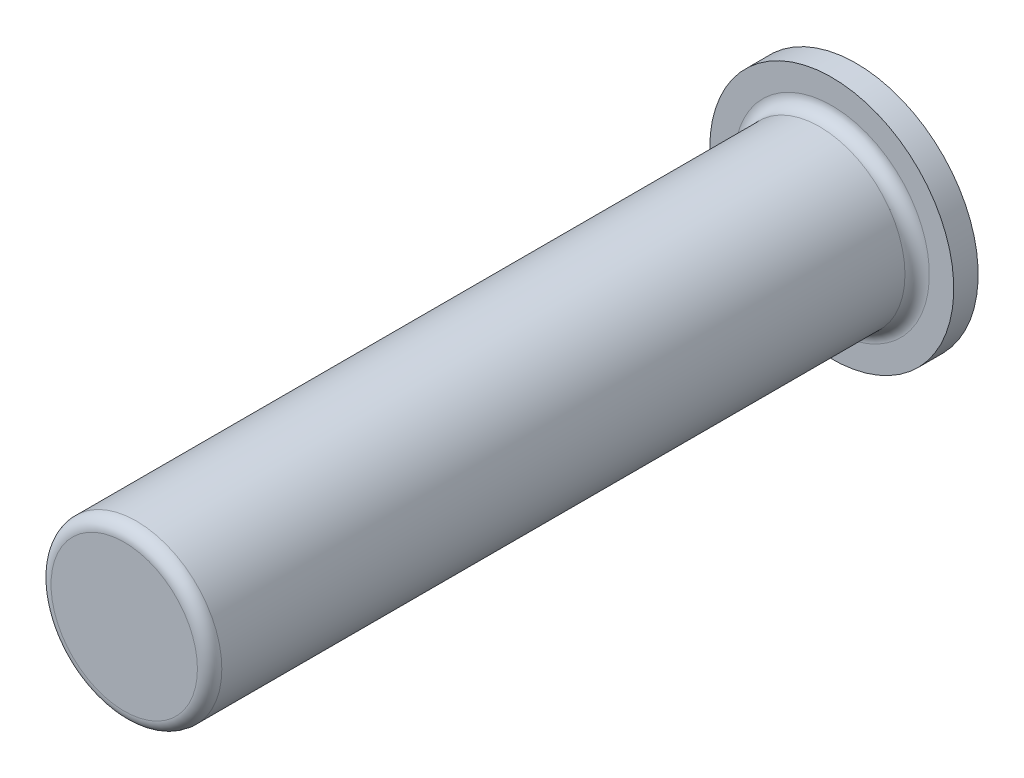
ISO-10303-21;
HEADER;
FILE_DESCRIPTION(('STEP AP214'),'2;1');
FILE_NAME('part.step','',(''),(''),'','','');
FILE_SCHEMA(('AUTOMOTIVE_DESIGN { 1 0 10303 214 1 1 1 1 }'));
ENDSEC;
DATA;
#1=APPLICATION_CONTEXT('core data for automotive mechanical design processes');
#2=APPLICATION_PROTOCOL_DEFINITION('international standard','automotive_design',2000,#1);
#3=PRODUCT_CONTEXT('',#1,'mechanical');
#4=PRODUCT('Part','Part','',(#3));
#5=PRODUCT_RELATED_PRODUCT_CATEGORY('part','',(#4));
#6=PRODUCT_DEFINITION_FORMATION('','',#4);
#7=PRODUCT_DEFINITION_CONTEXT('part definition',#1,'design');
#8=PRODUCT_DEFINITION('design','',#6,#7);
#9=PRODUCT_DEFINITION_SHAPE('','',#8);
#10=(LENGTH_UNIT() NAMED_UNIT(*) SI_UNIT(.MILLI.,.METRE.));
#11=(NAMED_UNIT(*) PLANE_ANGLE_UNIT() SI_UNIT($,.RADIAN.));
#12=(NAMED_UNIT(*) SI_UNIT($,.STERADIAN.) SOLID_ANGLE_UNIT());
#13=UNCERTAINTY_MEASURE_WITH_UNIT(LENGTH_MEASURE(1.E-05),#10,'distance_accuracy_value','');
#14=(GEOMETRIC_REPRESENTATION_CONTEXT(3) GLOBAL_UNCERTAINTY_ASSIGNED_CONTEXT((#13)) GLOBAL_UNIT_ASSIGNED_CONTEXT((#10,
#11,#12)) REPRESENTATION_CONTEXT('',''));
#15=CARTESIAN_POINT('',(0.,0.,0.));
#16=DIRECTION('',(0.,0.,1.));
#17=DIRECTION('',(1.,0.,0.));
#18=AXIS2_PLACEMENT_3D('',#15,#16,#17);
#19=CARTESIAN_POINT('',(0.,0.,120.));
#20=DIRECTION('',(0.,0.,-1.));
#21=DIRECTION('',(-1.,0.,0.));
#22=AXIS2_PLACEMENT_3D('',#19,#20,#21);
#23=CYLINDRICAL_SURFACE('',#22,7.5);
#24=CARTESIAN_POINT('',(0.,0.,0.));
#25=DIRECTION('',(0.,0.,1.));
#26=DIRECTION('',(1.,0.,0.));
#27=AXIS2_PLACEMENT_3D('',#24,#25,#26);
#28=CIRCLE('',#27,7.5);
#29=CARTESIAN_POINT('',(7.5,0.,0.));
#30=VERTEX_POINT('',#29);
#31=EDGE_CURVE('E52',#30,#30,#28,.T.);
#32=ORIENTED_EDGE('',*,*,#31,.F.);
#33=EDGE_LOOP('',(#32));
#34=FACE_BOUND('',#33,.T.);
#35=CARTESIAN_POINT('',(0.,0.,110.));
#36=DIRECTION('',(0.,0.,1.));
#37=DIRECTION('',(1.,0.,0.));
#38=AXIS2_PLACEMENT_3D('',#35,#36,#37);
#39=CIRCLE('',#38,7.5);
#40=CARTESIAN_POINT('',(7.5,0.,110.));
#41=VERTEX_POINT('',#40);
#42=EDGE_CURVE('E53',#41,#41,#39,.T.);
#43=ORIENTED_EDGE('',*,*,#42,.T.);
#44=EDGE_LOOP('',(#43));
#45=FACE_BOUND('',#44,.T.);
#46=ADVANCED_FACE('F32',(#34,#45),#23,.F.);
#47=CARTESIAN_POINT('',(0.,0.,0.));
#48=DIRECTION('',(0.,0.,1.));
#49=DIRECTION('',(1.,0.,0.));
#50=AXIS2_PLACEMENT_3D('',#47,#48,#49);
#51=PLANE('',#50);
#52=ORIENTED_EDGE('',*,*,#31,.T.);
#53=EDGE_LOOP('',(#52));
#54=FACE_BOUND('',#53,.T.);
#55=CARTESIAN_POINT('',(0.,0.,0.));
#56=DIRECTION('',(0.,0.,-1.));
#57=DIRECTION('',(-1.,0.,0.));
#58=AXIS2_PLACEMENT_3D('',#55,#56,#57);
#59=CIRCLE('',#58,20.);
#60=CARTESIAN_POINT('',(-20.,0.,0.));
#61=VERTEX_POINT('',#60);
#62=EDGE_CURVE('E59',#61,#61,#59,.T.);
#63=ORIENTED_EDGE('',*,*,#62,.T.);
#64=EDGE_LOOP('',(#63));
#65=FACE_BOUND('',#64,.T.);
#66=ADVANCED_FACE('F82',(#54,#65),#51,.F.);
#67=CARTESIAN_POINT('',(0.,0.,110.));
#68=DIRECTION('',(0.,0.,1.));
#69=DIRECTION('',(1.,0.,0.));
#70=AXIS2_PLACEMENT_3D('',#67,#68,#69);
#71=PLANE('',#70);
#72=ORIENTED_EDGE('',*,*,#42,.F.);
#73=EDGE_LOOP('',(#72));
#74=FACE_BOUND('',#73,.T.);
#75=ADVANCED_FACE('F79',(#74),#71,.F.);
#76=CARTESIAN_POINT('',(0.,0.,4.));
#77=DIRECTION('',(0.,0.,-1.));
#78=DIRECTION('',(-1.,0.,0.));
#79=AXIS2_PLACEMENT_3D('',#76,#77,#78);
#80=CYLINDRICAL_SURFACE('',#79,20.);
#81=CARTESIAN_POINT('',(0.,0.,4.));
#82=DIRECTION('',(0.,0.,-1.));
#83=DIRECTION('',(-1.,0.,0.));
#84=AXIS2_PLACEMENT_3D('',#81,#82,#83);
#85=CIRCLE('',#84,20.);
#86=CARTESIAN_POINT('',(-20.,0.,4.));
#87=VERTEX_POINT('',#86);
#88=EDGE_CURVE('E56',#87,#87,#85,.T.);
#89=ORIENTED_EDGE('',*,*,#88,.T.);
#90=EDGE_LOOP('',(#89));
#91=FACE_BOUND('',#90,.T.);
#92=ORIENTED_EDGE('',*,*,#62,.F.);
#93=EDGE_LOOP('',(#92));
#94=FACE_BOUND('',#93,.T.);
#95=ADVANCED_FACE('F65',(#91,#94),#80,.T.);
#96=CARTESIAN_POINT('',(0.,0.,4.));
#97=DIRECTION('',(0.,0.,-1.));
#98=DIRECTION('',(-1.,0.,0.));
#99=AXIS2_PLACEMENT_3D('',#96,#97,#98);
#100=PLANE('',#99);
#101=CARTESIAN_POINT('',(0.,0.,4.));
#102=DIRECTION('',(0.,0.,-1.));
#103=DIRECTION('',(-1.,0.,0.));
#104=AXIS2_PLACEMENT_3D('',#101,#102,#103);
#105=CIRCLE('',#104,16.);
#106=CARTESIAN_POINT('',(-16.,0.,4.));
#107=VERTEX_POINT('',#106);
#108=EDGE_CURVE('E47',#107,#107,#105,.T.);
#109=ORIENTED_EDGE('',*,*,#108,.T.);
#110=EDGE_LOOP('',(#109));
#111=FACE_BOUND('',#110,.T.);
#112=ORIENTED_EDGE('',*,*,#88,.F.);
#113=EDGE_LOOP('',(#112));
#114=FACE_BOUND('',#113,.T.);
#115=ADVANCED_FACE('F68',(#111,#114),#100,.F.);
#116=CARTESIAN_POINT('',(0.,0.,120.));
#117=DIRECTION('',(0.,0.,1.));
#118=DIRECTION('',(1.,0.,0.));
#119=AXIS2_PLACEMENT_3D('',#116,#117,#118);
#120=PLANE('',#119);
#121=CARTESIAN_POINT('',(0.,0.,120.));
#122=DIRECTION('',(0.,0.,1.));
#123=DIRECTION('',(1.,0.,0.));
#124=AXIS2_PLACEMENT_3D('',#121,#122,#123);
#125=CIRCLE('',#124,12.);
#126=CARTESIAN_POINT('',(12.,0.,120.));
#127=VERTEX_POINT('',#126);
#128=EDGE_CURVE('E10',#127,#127,#125,.T.);
#129=ORIENTED_EDGE('',*,*,#128,.T.);
#130=EDGE_LOOP('',(#129));
#131=FACE_BOUND('',#130,.T.);
#132=ADVANCED_FACE('F70',(#131),#120,.T.);
#133=CARTESIAN_POINT('',(0.,0.,120.));
#134=DIRECTION('',(0.,0.,-1.));
#135=DIRECTION('',(-1.,0.,0.));
#136=AXIS2_PLACEMENT_3D('',#133,#134,#135);
#137=CYLINDRICAL_SURFACE('',#136,14.);
#138=CARTESIAN_POINT('',(0.,0.,6.00000000000001));
#139=DIRECTION('',(0.,0.,-1.));
#140=DIRECTION('',(-1.,0.,0.));
#141=AXIS2_PLACEMENT_3D('',#138,#139,#140);
#142=CIRCLE('',#141,14.);
#143=CARTESIAN_POINT('',(-14.,0.,6.00000000000001));
#144=VERTEX_POINT('',#143);
#145=EDGE_CURVE('E39',#144,#144,#142,.F.);
#146=ORIENTED_EDGE('',*,*,#145,.T.);
#147=EDGE_LOOP('',(#146));
#148=FACE_BOUND('',#147,.T.);
#149=CARTESIAN_POINT('',(0.,0.,118.));
#150=DIRECTION('',(0.,0.,1.));
#151=DIRECTION('',(1.,0.,0.));
#152=AXIS2_PLACEMENT_3D('',#149,#150,#151);
#153=CIRCLE('',#152,14.);
#154=CARTESIAN_POINT('',(14.,0.,118.));
#155=VERTEX_POINT('',#154);
#156=EDGE_CURVE('E43',#155,#155,#153,.F.);
#157=ORIENTED_EDGE('',*,*,#156,.T.);
#158=EDGE_LOOP('',(#157));
#159=FACE_BOUND('',#158,.T.);
#160=ADVANCED_FACE('F77',(#148,#159),#137,.T.);
#161=CARTESIAN_POINT('',(0.,0.,6.00000000000001));
#162=DIRECTION('',(0.,0.,-1.));
#163=DIRECTION('',(-1.,0.,0.));
#164=AXIS2_PLACEMENT_3D('',#161,#162,#163);
#165=TOROIDAL_SURFACE('',#164,16.,2.);
#166=ORIENTED_EDGE('',*,*,#145,.F.);
#167=EDGE_LOOP('',(#166));
#168=FACE_BOUND('',#167,.T.);
#169=ORIENTED_EDGE('',*,*,#108,.F.);
#170=EDGE_LOOP('',(#169));
#171=FACE_BOUND('',#170,.T.);
#172=ADVANCED_FACE('F95',(#168,#171),#165,.F.);
#173=CARTESIAN_POINT('',(0.,0.,118.));
#174=DIRECTION('',(0.,0.,1.));
#175=DIRECTION('',(1.,0.,0.));
#176=AXIS2_PLACEMENT_3D('',#173,#174,#175);
#177=TOROIDAL_SURFACE('',#176,12.,2.);
#178=ORIENTED_EDGE('',*,*,#156,.F.);
#179=EDGE_LOOP('',(#178));
#180=FACE_BOUND('',#179,.T.);
#181=ORIENTED_EDGE('',*,*,#128,.F.);
#182=EDGE_LOOP('',(#181));
#183=FACE_BOUND('',#182,.T.);
#184=ADVANCED_FACE('F34',(#180,#183),#177,.T.);
#185=CLOSED_SHELL('',(#46,#66,#75,#95,#115,#132,#160,#172,#184));
#186=MANIFOLD_SOLID_BREP('B2',#185);
#187=ADVANCED_BREP_SHAPE_REPRESENTATION('',(#18,#186),#14);
#188=SHAPE_DEFINITION_REPRESENTATION(#9,#187);
ENDSEC;
END-ISO-10303-21;
